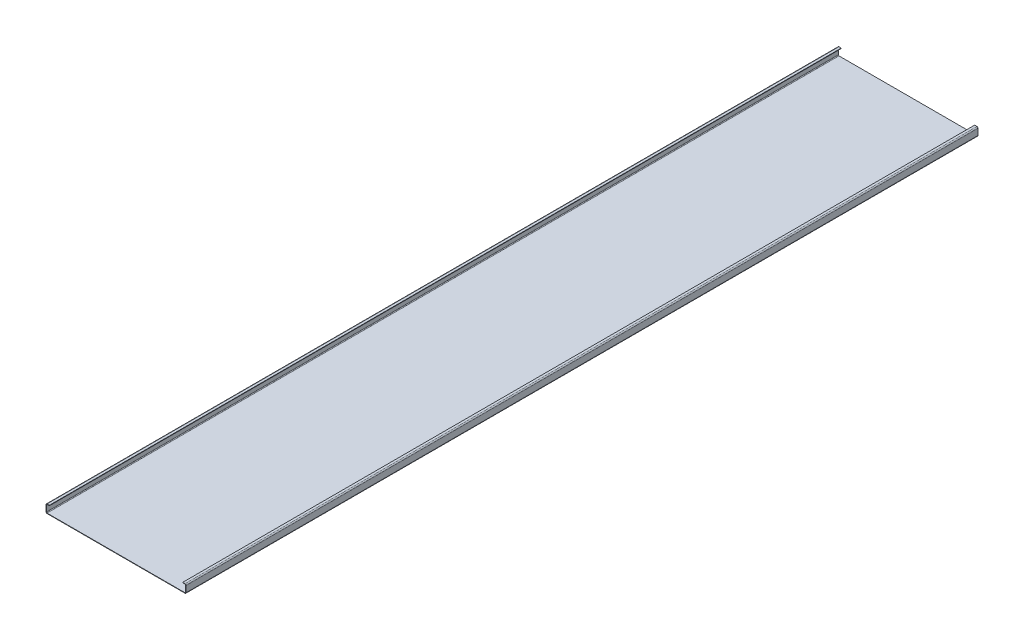
ISO-10303-21;
HEADER;
FILE_DESCRIPTION(('STEP AP214'),'2;1');
FILE_NAME('part.step','',(''),(''),'','','');
FILE_SCHEMA(('AUTOMOTIVE_DESIGN { 1 0 10303 214 1 1 1 1 }'));
ENDSEC;
DATA;
#1=APPLICATION_CONTEXT('core data for automotive mechanical design processes');
#2=APPLICATION_PROTOCOL_DEFINITION('international standard','automotive_design',2000,#1);
#3=PRODUCT_CONTEXT('',#1,'mechanical');
#4=PRODUCT('Part','Part','',(#3));
#5=PRODUCT_RELATED_PRODUCT_CATEGORY('part','',(#4));
#6=PRODUCT_DEFINITION_FORMATION('','',#4);
#7=PRODUCT_DEFINITION_CONTEXT('part definition',#1,'design');
#8=PRODUCT_DEFINITION('design','',#6,#7);
#9=PRODUCT_DEFINITION_SHAPE('','',#8);
#10=(LENGTH_UNIT() NAMED_UNIT(*) SI_UNIT(.MILLI.,.METRE.));
#11=(NAMED_UNIT(*) PLANE_ANGLE_UNIT() SI_UNIT($,.RADIAN.));
#12=(NAMED_UNIT(*) SI_UNIT($,.STERADIAN.) SOLID_ANGLE_UNIT());
#13=UNCERTAINTY_MEASURE_WITH_UNIT(LENGTH_MEASURE(1.E-05),#10,'distance_accuracy_value','');
#14=(GEOMETRIC_REPRESENTATION_CONTEXT(3) GLOBAL_UNCERTAINTY_ASSIGNED_CONTEXT((#13)) GLOBAL_UNIT_ASSIGNED_CONTEXT((#10,
#11,#12)) REPRESENTATION_CONTEXT('',''));
#15=CARTESIAN_POINT('',(0.,0.,0.));
#16=DIRECTION('',(0.,0.,1.));
#17=DIRECTION('',(1.,0.,0.));
#18=AXIS2_PLACEMENT_3D('',#15,#16,#17);
#19=CARTESIAN_POINT('',(3.25,25.,2380.));
#20=DIRECTION('',(0.,0.,1.));
#21=DIRECTION('',(1.,0.,0.));
#22=AXIS2_PLACEMENT_3D('',#19,#20,#21);
#23=PLANE('',#22);
#24=DIRECTION('',(0.,-1.,0.));
#25=VECTOR('',#24,1.);
#26=CARTESIAN_POINT('',(3.25,25.,2380.));
#27=LINE('',#26,#25);
#28=CARTESIAN_POINT('',(3.25,25.,2380.));
#29=VERTEX_POINT('',#28);
#30=CARTESIAN_POINT('',(3.25,23.75,2380.));
#31=VERTEX_POINT('',#30);
#32=EDGE_CURVE('E11',#29,#31,#27,.T.);
#33=ORIENTED_EDGE('',*,*,#32,.F.);
#34=CARTESIAN_POINT('',(3.25,21.75,2380.));
#35=DIRECTION('',(0.,0.,-1.));
#36=DIRECTION('',(-1.,0.,0.));
#37=AXIS2_PLACEMENT_3D('',#34,#35,#36);
#38=CIRCLE('',#37,3.25);
#39=CARTESIAN_POINT('',(0.,21.75,2380.));
#40=VERTEX_POINT('',#39);
#41=EDGE_CURVE('E361',#29,#40,#38,.F.);
#42=ORIENTED_EDGE('',*,*,#41,.T.);
#43=DIRECTION('',(-1.,0.,0.));
#44=VECTOR('',#43,1.);
#45=CARTESIAN_POINT('',(1.25,21.75,2380.));
#46=LINE('',#45,#44);
#47=CARTESIAN_POINT('',(1.25,21.75,2380.));
#48=VERTEX_POINT('',#47);
#49=EDGE_CURVE('E44',#48,#40,#46,.T.);
#50=ORIENTED_EDGE('',*,*,#49,.F.);
#51=CARTESIAN_POINT('',(3.25,21.75,2380.));
#52=DIRECTION('',(0.,0.,1.));
#53=DIRECTION('',(1.,0.,0.));
#54=AXIS2_PLACEMENT_3D('',#51,#52,#53);
#55=CIRCLE('',#54,2.);
#56=EDGE_CURVE('E436',#31,#48,#55,.T.);
#57=ORIENTED_EDGE('',*,*,#56,.F.);
#58=EDGE_LOOP('',(#33,#42,#50,#57));
#59=FACE_BOUND('',#58,.T.);
#60=ADVANCED_FACE('F36',(#59),#23,.T.);
#61=CARTESIAN_POINT('',(1.25,21.75,2380.));
#62=DIRECTION('',(0.,0.,1.));
#63=DIRECTION('',(1.,0.,0.));
#64=AXIS2_PLACEMENT_3D('',#61,#62,#63);
#65=PLANE('',#64);
#66=DIRECTION('',(-1.,0.,0.));
#67=VECTOR('',#66,1.);
#68=CARTESIAN_POINT('',(10.,25.,2380.));
#69=LINE('',#68,#67);
#70=CARTESIAN_POINT('',(10.,25.,2380.));
#71=VERTEX_POINT('',#70);
#72=EDGE_CURVE('E365',#71,#29,#69,.T.);
#73=ORIENTED_EDGE('',*,*,#72,.T.);
#74=ORIENTED_EDGE('',*,*,#32,.T.);
#75=DIRECTION('',(1.,0.,0.));
#76=VECTOR('',#75,1.);
#77=CARTESIAN_POINT('',(10.,23.75,2380.));
#78=LINE('',#77,#76);
#79=CARTESIAN_POINT('',(10.,23.75,2380.));
#80=VERTEX_POINT('',#79);
#81=EDGE_CURVE('E438',#80,#31,#78,.F.);
#82=ORIENTED_EDGE('',*,*,#81,.F.);
#83=DIRECTION('',(0.,-1.,0.));
#84=VECTOR('',#83,1.);
#85=CARTESIAN_POINT('',(10.,25.,2380.));
#86=LINE('',#85,#84);
#87=EDGE_CURVE('E441',#71,#80,#86,.T.);
#88=ORIENTED_EDGE('',*,*,#87,.F.);
#89=EDGE_LOOP('',(#73,#74,#82,#88));
#90=FACE_BOUND('',#89,.T.);
#91=ADVANCED_FACE('F447',(#90),#65,.T.);
#92=CARTESIAN_POINT('',(0.,21.75,0.));
#93=DIRECTION('',(0.,0.,-1.));
#94=DIRECTION('',(-1.,0.,0.));
#95=AXIS2_PLACEMENT_3D('',#92,#93,#94);
#96=PLANE('',#95);
#97=DIRECTION('',(1.,0.,0.));
#98=VECTOR('',#97,1.);
#99=CARTESIAN_POINT('',(0.,21.75,0.));
#100=LINE('',#99,#98);
#101=CARTESIAN_POINT('',(0.,21.75,0.));
#102=VERTEX_POINT('',#101);
#103=CARTESIAN_POINT('',(1.25,21.75,0.));
#104=VERTEX_POINT('',#103);
#105=EDGE_CURVE('E345',#102,#104,#100,.T.);
#106=ORIENTED_EDGE('',*,*,#105,.F.);
#107=CARTESIAN_POINT('',(3.25,21.75,0.));
#108=DIRECTION('',(0.,0.,-1.));
#109=DIRECTION('',(-1.,0.,0.));
#110=AXIS2_PLACEMENT_3D('',#107,#108,#109);
#111=CIRCLE('',#110,3.25);
#112=CARTESIAN_POINT('',(3.25,25.,0.));
#113=VERTEX_POINT('',#112);
#114=EDGE_CURVE('E261',#113,#102,#111,.F.);
#115=ORIENTED_EDGE('',*,*,#114,.F.);
#116=DIRECTION('',(0.,1.,0.));
#117=VECTOR('',#116,1.);
#118=CARTESIAN_POINT('',(3.25,23.75,0.));
#119=LINE('',#118,#117);
#120=CARTESIAN_POINT('',(3.25,23.75,0.));
#121=VERTEX_POINT('',#120);
#122=EDGE_CURVE('E343',#121,#113,#119,.T.);
#123=ORIENTED_EDGE('',*,*,#122,.F.);
#124=CARTESIAN_POINT('',(3.25,21.75,0.));
#125=DIRECTION('',(0.,0.,1.));
#126=DIRECTION('',(1.,0.,0.));
#127=AXIS2_PLACEMENT_3D('',#124,#125,#126);
#128=CIRCLE('',#127,2.);
#129=EDGE_CURVE('E249',#121,#104,#128,.T.);
#130=ORIENTED_EDGE('',*,*,#129,.T.);
#131=EDGE_LOOP('',(#106,#115,#123,#130));
#132=FACE_BOUND('',#131,.T.);
#133=ADVANCED_FACE('F454',(#132),#96,.T.);
#134=CARTESIAN_POINT('',(3.25,23.75,0.));
#135=DIRECTION('',(0.,0.,-1.));
#136=DIRECTION('',(-1.,0.,0.));
#137=AXIS2_PLACEMENT_3D('',#134,#135,#136);
#138=PLANE('',#137);
#139=DIRECTION('',(0.,-1.,0.));
#140=VECTOR('',#139,1.);
#141=CARTESIAN_POINT('',(0.,25.,0.));
#142=LINE('',#141,#140);
#143=CARTESIAN_POINT('',(0.,3.25,0.));
#144=VERTEX_POINT('',#143);
#145=EDGE_CURVE('E264',#102,#144,#142,.T.);
#146=ORIENTED_EDGE('',*,*,#145,.F.);
#147=ORIENTED_EDGE('',*,*,#105,.T.);
#148=DIRECTION('',(0.,1.,0.));
#149=VECTOR('',#148,1.);
#150=CARTESIAN_POINT('',(1.25,25.,0.));
#151=LINE('',#150,#149);
#152=CARTESIAN_POINT('',(1.25,3.25,0.));
#153=VERTEX_POINT('',#152);
#154=EDGE_CURVE('E246',#104,#153,#151,.F.);
#155=ORIENTED_EDGE('',*,*,#154,.T.);
#156=DIRECTION('',(-1.,0.,0.));
#157=VECTOR('',#156,1.);
#158=CARTESIAN_POINT('',(1.25,3.25,0.));
#159=LINE('',#158,#157);
#160=EDGE_CURVE('E335',#153,#144,#159,.T.);
#161=ORIENTED_EDGE('',*,*,#160,.T.);
#162=EDGE_LOOP('',(#146,#147,#155,#161));
#163=FACE_BOUND('',#162,.T.);
#164=ADVANCED_FACE('F457',(#163),#138,.T.);
#165=CARTESIAN_POINT('',(0.,3.25,2380.));
#166=DIRECTION('',(0.,0.,1.));
#167=DIRECTION('',(1.,0.,0.));
#168=AXIS2_PLACEMENT_3D('',#165,#166,#167);
#169=PLANE('',#168);
#170=DIRECTION('',(1.,0.,0.));
#171=VECTOR('',#170,1.);
#172=CARTESIAN_POINT('',(0.,3.25,2380.));
#173=LINE('',#172,#171);
#174=CARTESIAN_POINT('',(0.,3.25,2380.));
#175=VERTEX_POINT('',#174);
#176=CARTESIAN_POINT('',(1.25,3.25,2380.));
#177=VERTEX_POINT('',#176);
#178=EDGE_CURVE('E341',#175,#177,#173,.T.);
#179=ORIENTED_EDGE('',*,*,#178,.F.);
#180=CARTESIAN_POINT('',(3.25,3.25,2380.));
#181=DIRECTION('',(0.,0.,-1.));
#182=DIRECTION('',(-1.,0.,0.));
#183=AXIS2_PLACEMENT_3D('',#180,#181,#182);
#184=CIRCLE('',#183,3.25);
#185=CARTESIAN_POINT('',(3.25,0.,2380.));
#186=VERTEX_POINT('',#185);
#187=EDGE_CURVE('E373',#175,#186,#184,.F.);
#188=ORIENTED_EDGE('',*,*,#187,.T.);
#189=DIRECTION('',(0.,-1.,0.));
#190=VECTOR('',#189,1.);
#191=CARTESIAN_POINT('',(3.25,1.25,2380.));
#192=LINE('',#191,#190);
#193=CARTESIAN_POINT('',(3.25,1.25,2380.));
#194=VERTEX_POINT('',#193);
#195=EDGE_CURVE('E339',#194,#186,#192,.T.);
#196=ORIENTED_EDGE('',*,*,#195,.F.);
#197=CARTESIAN_POINT('',(3.25,3.25,2380.));
#198=DIRECTION('',(0.,0.,1.));
#199=DIRECTION('',(1.,0.,0.));
#200=AXIS2_PLACEMENT_3D('',#197,#198,#199);
#201=CIRCLE('',#200,2.);
#202=EDGE_CURVE('E432',#177,#194,#201,.T.);
#203=ORIENTED_EDGE('',*,*,#202,.F.);
#204=EDGE_LOOP('',(#179,#188,#196,#203));
#205=FACE_BOUND('',#204,.T.);
#206=ADVANCED_FACE('F477',(#205),#169,.T.);
#207=CARTESIAN_POINT('',(3.25,1.25,2380.));
#208=DIRECTION('',(0.,0.,1.));
#209=DIRECTION('',(1.,0.,0.));
#210=AXIS2_PLACEMENT_3D('',#207,#208,#209);
#211=PLANE('',#210);
#212=DIRECTION('',(0.,-1.,0.));
#213=VECTOR('',#212,1.);
#214=CARTESIAN_POINT('',(0.,25.,2380.));
#215=LINE('',#214,#213);
#216=EDGE_CURVE('E352',#40,#175,#215,.T.);
#217=ORIENTED_EDGE('',*,*,#216,.T.);
#218=ORIENTED_EDGE('',*,*,#178,.T.);
#219=DIRECTION('',(0.,1.,0.));
#220=VECTOR('',#219,1.);
#221=CARTESIAN_POINT('',(1.25,25.,2380.));
#222=LINE('',#221,#220);
#223=EDGE_CURVE('E355',#48,#177,#222,.F.);
#224=ORIENTED_EDGE('',*,*,#223,.F.);
#225=ORIENTED_EDGE('',*,*,#49,.T.);
#226=EDGE_LOOP('',(#217,#218,#224,#225));
#227=FACE_BOUND('',#226,.T.);
#228=ADVANCED_FACE('F350',(#227),#211,.T.);
#229=CARTESIAN_POINT('',(3.25,0.,0.));
#230=DIRECTION('',(0.,0.,-1.));
#231=DIRECTION('',(-1.,0.,0.));
#232=AXIS2_PLACEMENT_3D('',#229,#230,#231);
#233=PLANE('',#232);
#234=DIRECTION('',(0.,1.,0.));
#235=VECTOR('',#234,1.);
#236=CARTESIAN_POINT('',(3.25,0.,0.));
#237=LINE('',#236,#235);
#238=CARTESIAN_POINT('',(3.25,0.,0.));
#239=VERTEX_POINT('',#238);
#240=CARTESIAN_POINT('',(3.25,1.25,0.));
#241=VERTEX_POINT('',#240);
#242=EDGE_CURVE('E337',#239,#241,#237,.T.);
#243=ORIENTED_EDGE('',*,*,#242,.F.);
#244=CARTESIAN_POINT('',(3.25,3.25,0.));
#245=DIRECTION('',(0.,0.,-1.));
#246=DIRECTION('',(-1.,0.,0.));
#247=AXIS2_PLACEMENT_3D('',#244,#245,#246);
#248=CIRCLE('',#247,3.25);
#249=EDGE_CURVE('E267',#144,#239,#248,.F.);
#250=ORIENTED_EDGE('',*,*,#249,.F.);
#251=ORIENTED_EDGE('',*,*,#160,.F.);
#252=CARTESIAN_POINT('',(3.25,3.25,0.));
#253=DIRECTION('',(0.,0.,1.));
#254=DIRECTION('',(1.,0.,0.));
#255=AXIS2_PLACEMENT_3D('',#252,#253,#254);
#256=CIRCLE('',#255,2.);
#257=EDGE_CURVE('E243',#153,#241,#256,.T.);
#258=ORIENTED_EDGE('',*,*,#257,.T.);
#259=EDGE_LOOP('',(#243,#250,#251,#258));
#260=FACE_BOUND('',#259,.T.);
#261=ADVANCED_FACE('F471',(#260),#233,.T.);
#262=CARTESIAN_POINT('',(1.25,3.25,0.));
#263=DIRECTION('',(0.,0.,-1.));
#264=DIRECTION('',(-1.,0.,0.));
#265=AXIS2_PLACEMENT_3D('',#262,#263,#264);
#266=PLANE('',#265);
#267=DIRECTION('',(1.,0.,0.));
#268=VECTOR('',#267,1.);
#269=CARTESIAN_POINT('',(0.,0.,0.));
#270=LINE('',#269,#268);
#271=CARTESIAN_POINT('',(417.75,0.,0.));
#272=VERTEX_POINT('',#271);
#273=EDGE_CURVE('E270',#239,#272,#270,.T.);
#274=ORIENTED_EDGE('',*,*,#273,.F.);
#275=ORIENTED_EDGE('',*,*,#242,.T.);
#276=DIRECTION('',(1.,0.,0.));
#277=VECTOR('',#276,1.);
#278=CARTESIAN_POINT('',(0.,1.25,0.));
#279=LINE('',#278,#277);
#280=CARTESIAN_POINT('',(417.75,1.25,0.));
#281=VERTEX_POINT('',#280);
#282=EDGE_CURVE('E240',#241,#281,#279,.T.);
#283=ORIENTED_EDGE('',*,*,#282,.T.);
#284=DIRECTION('',(0.,-1.,0.));
#285=VECTOR('',#284,1.);
#286=CARTESIAN_POINT('',(417.75,1.25,0.));
#287=LINE('',#286,#285);
#288=EDGE_CURVE('E331',#281,#272,#287,.T.);
#289=ORIENTED_EDGE('',*,*,#288,.T.);
#290=EDGE_LOOP('',(#274,#275,#283,#289));
#291=FACE_BOUND('',#290,.T.);
#292=ADVANCED_FACE('F481',(#291),#266,.T.);
#293=CARTESIAN_POINT('',(417.75,0.,2380.));
#294=DIRECTION('',(0.,0.,1.));
#295=DIRECTION('',(1.,0.,0.));
#296=AXIS2_PLACEMENT_3D('',#293,#294,#295);
#297=PLANE('',#296);
#298=DIRECTION('',(0.,1.,0.));
#299=VECTOR('',#298,1.);
#300=CARTESIAN_POINT('',(417.75,0.,2380.));
#301=LINE('',#300,#299);
#302=CARTESIAN_POINT('',(417.75,0.,2380.));
#303=VERTEX_POINT('',#302);
#304=CARTESIAN_POINT('',(417.75,1.25,2380.));
#305=VERTEX_POINT('',#304);
#306=EDGE_CURVE('E193',#303,#305,#301,.T.);
#307=ORIENTED_EDGE('',*,*,#306,.F.);
#308=CARTESIAN_POINT('',(417.75,3.25,2380.));
#309=DIRECTION('',(0.,0.,-1.));
#310=DIRECTION('',(-1.,0.,0.));
#311=AXIS2_PLACEMENT_3D('',#308,#309,#310);
#312=CIRCLE('',#311,3.25);
#313=CARTESIAN_POINT('',(421.,3.25,2380.));
#314=VERTEX_POINT('',#313);
#315=EDGE_CURVE('E197',#303,#314,#312,.F.);
#316=ORIENTED_EDGE('',*,*,#315,.T.);
#317=DIRECTION('',(1.,0.,0.));
#318=VECTOR('',#317,1.);
#319=CARTESIAN_POINT('',(419.75,3.25,2380.));
#320=LINE('',#319,#318);
#321=CARTESIAN_POINT('',(419.75,3.25,2380.));
#322=VERTEX_POINT('',#321);
#323=EDGE_CURVE('E181',#322,#314,#320,.T.);
#324=ORIENTED_EDGE('',*,*,#323,.F.);
#325=CARTESIAN_POINT('',(417.75,3.25,2380.));
#326=DIRECTION('',(0.,0.,1.));
#327=DIRECTION('',(1.,0.,0.));
#328=AXIS2_PLACEMENT_3D('',#325,#326,#327);
#329=CIRCLE('',#328,2.);
#330=EDGE_CURVE('E394',#305,#322,#329,.T.);
#331=ORIENTED_EDGE('',*,*,#330,.F.);
#332=EDGE_LOOP('',(#307,#316,#324,#331));
#333=FACE_BOUND('',#332,.T.);
#334=ADVANCED_FACE('F199',(#333),#297,.T.);
#335=CARTESIAN_POINT('',(419.75,3.25,2380.));
#336=DIRECTION('',(0.,0.,1.));
#337=DIRECTION('',(1.,0.,0.));
#338=AXIS2_PLACEMENT_3D('',#335,#336,#337);
#339=PLANE('',#338);
#340=DIRECTION('',(1.,0.,0.));
#341=VECTOR('',#340,1.);
#342=CARTESIAN_POINT('',(0.,0.,2380.));
#343=LINE('',#342,#341);
#344=EDGE_CURVE('E203',#186,#303,#343,.T.);
#345=ORIENTED_EDGE('',*,*,#344,.T.);
#346=ORIENTED_EDGE('',*,*,#306,.T.);
#347=DIRECTION('',(1.,0.,0.));
#348=VECTOR('',#347,1.);
#349=CARTESIAN_POINT('',(0.,1.25,2380.));
#350=LINE('',#349,#348);
#351=EDGE_CURVE('E429',#194,#305,#350,.T.);
#352=ORIENTED_EDGE('',*,*,#351,.F.);
#353=ORIENTED_EDGE('',*,*,#195,.T.);
#354=EDGE_LOOP('',(#345,#346,#352,#353));
#355=FACE_BOUND('',#354,.T.);
#356=ADVANCED_FACE('F381',(#355),#339,.T.);
#357=CARTESIAN_POINT('',(421.,3.25,0.));
#358=DIRECTION('',(0.,0.,-1.));
#359=DIRECTION('',(-1.,0.,0.));
#360=AXIS2_PLACEMENT_3D('',#357,#358,#359);
#361=PLANE('',#360);
#362=DIRECTION('',(-1.,0.,0.));
#363=VECTOR('',#362,1.);
#364=CARTESIAN_POINT('',(421.,3.25,0.));
#365=LINE('',#364,#363);
#366=CARTESIAN_POINT('',(421.,3.25,0.));
#367=VERTEX_POINT('',#366);
#368=CARTESIAN_POINT('',(419.75,3.25,0.));
#369=VERTEX_POINT('',#368);
#370=EDGE_CURVE('E194',#367,#369,#365,.T.);
#371=ORIENTED_EDGE('',*,*,#370,.F.);
#372=CARTESIAN_POINT('',(417.75,3.25,0.));
#373=DIRECTION('',(0.,0.,-1.));
#374=DIRECTION('',(-1.,0.,0.));
#375=AXIS2_PLACEMENT_3D('',#372,#373,#374);
#376=CIRCLE('',#375,3.25);
#377=EDGE_CURVE('E210',#272,#367,#376,.F.);
#378=ORIENTED_EDGE('',*,*,#377,.F.);
#379=ORIENTED_EDGE('',*,*,#288,.F.);
#380=CARTESIAN_POINT('',(417.75,3.25,0.));
#381=DIRECTION('',(0.,0.,1.));
#382=DIRECTION('',(1.,0.,0.));
#383=AXIS2_PLACEMENT_3D('',#380,#381,#382);
#384=CIRCLE('',#383,2.);
#385=EDGE_CURVE('E237',#281,#369,#384,.T.);
#386=ORIENTED_EDGE('',*,*,#385,.T.);
#387=EDGE_LOOP('',(#371,#378,#379,#386));
#388=FACE_BOUND('',#387,.T.);
#389=ADVANCED_FACE('F388',(#388),#361,.T.);
#390=CARTESIAN_POINT('',(417.75,1.25,0.));
#391=DIRECTION('',(0.,0.,-1.));
#392=DIRECTION('',(-1.,0.,0.));
#393=AXIS2_PLACEMENT_3D('',#390,#391,#392);
#394=PLANE('',#393);
#395=DIRECTION('',(0.,1.,0.));
#396=VECTOR('',#395,1.);
#397=CARTESIAN_POINT('',(421.,0.,0.));
#398=LINE('',#397,#396);
#399=CARTESIAN_POINT('',(421.,21.75,0.));
#400=VERTEX_POINT('',#399);
#401=EDGE_CURVE('E274',#367,#400,#398,.T.);
#402=ORIENTED_EDGE('',*,*,#401,.F.);
#403=ORIENTED_EDGE('',*,*,#370,.T.);
#404=DIRECTION('',(0.,1.,0.));
#405=VECTOR('',#404,1.);
#406=CARTESIAN_POINT('',(419.75,0.,0.));
#407=LINE('',#406,#405);
#408=CARTESIAN_POINT('',(419.75,21.75,0.));
#409=VERTEX_POINT('',#408);
#410=EDGE_CURVE('E235',#369,#409,#407,.T.);
#411=ORIENTED_EDGE('',*,*,#410,.T.);
#412=DIRECTION('',(1.,0.,0.));
#413=VECTOR('',#412,1.);
#414=CARTESIAN_POINT('',(419.75,21.75,0.));
#415=LINE('',#414,#413);
#416=EDGE_CURVE('E117',#409,#400,#415,.T.);
#417=ORIENTED_EDGE('',*,*,#416,.T.);
#418=EDGE_LOOP('',(#402,#403,#411,#417));
#419=FACE_BOUND('',#418,.T.);
#420=ADVANCED_FACE('F390',(#419),#394,.T.);
#421=CARTESIAN_POINT('',(421.,21.75,2380.));
#422=DIRECTION('',(0.,0.,1.));
#423=DIRECTION('',(1.,0.,0.));
#424=AXIS2_PLACEMENT_3D('',#421,#422,#423);
#425=PLANE('',#424);
#426=DIRECTION('',(-1.,0.,0.));
#427=VECTOR('',#426,1.);
#428=CARTESIAN_POINT('',(421.,21.75,2380.));
#429=LINE('',#428,#427);
#430=CARTESIAN_POINT('',(421.,21.75,2380.));
#431=VERTEX_POINT('',#430);
#432=CARTESIAN_POINT('',(419.75,21.75,2380.));
#433=VERTEX_POINT('',#432);
#434=EDGE_CURVE('E329',#431,#433,#429,.T.);
#435=ORIENTED_EDGE('',*,*,#434,.F.);
#436=CARTESIAN_POINT('',(417.75,21.75,2380.));
#437=DIRECTION('',(0.,0.,-1.));
#438=DIRECTION('',(-1.,0.,0.));
#439=AXIS2_PLACEMENT_3D('',#436,#437,#438);
#440=CIRCLE('',#439,3.25);
#441=CARTESIAN_POINT('',(417.75,25.,2380.));
#442=VERTEX_POINT('',#441);
#443=EDGE_CURVE('E218',#431,#442,#440,.F.);
#444=ORIENTED_EDGE('',*,*,#443,.T.);
#445=DIRECTION('',(0.,1.,0.));
#446=VECTOR('',#445,1.);
#447=CARTESIAN_POINT('',(417.75,23.75,2380.));
#448=LINE('',#447,#446);
#449=CARTESIAN_POINT('',(417.75,23.75,2380.));
#450=VERTEX_POINT('',#449);
#451=EDGE_CURVE('E52',#450,#442,#448,.T.);
#452=ORIENTED_EDGE('',*,*,#451,.F.);
#453=CARTESIAN_POINT('',(417.75,21.75,2380.));
#454=DIRECTION('',(0.,0.,1.));
#455=DIRECTION('',(1.,0.,0.));
#456=AXIS2_PLACEMENT_3D('',#453,#454,#455);
#457=CIRCLE('',#456,2.);
#458=EDGE_CURVE('E422',#433,#450,#457,.T.);
#459=ORIENTED_EDGE('',*,*,#458,.F.);
#460=EDGE_LOOP('',(#435,#444,#452,#459));
#461=FACE_BOUND('',#460,.T.);
#462=ADVANCED_FACE('F552',(#461),#425,.T.);
#463=CARTESIAN_POINT('',(417.75,23.75,2380.));
#464=DIRECTION('',(0.,0.,1.));
#465=DIRECTION('',(1.,0.,0.));
#466=AXIS2_PLACEMENT_3D('',#463,#464,#465);
#467=PLANE('',#466);
#468=DIRECTION('',(0.,1.,0.));
#469=VECTOR('',#468,1.);
#470=CARTESIAN_POINT('',(421.,0.,2380.));
#471=LINE('',#470,#469);
#472=EDGE_CURVE('E185',#314,#431,#471,.T.);
#473=ORIENTED_EDGE('',*,*,#472,.T.);
#474=ORIENTED_EDGE('',*,*,#434,.T.);
#475=DIRECTION('',(0.,1.,0.));
#476=VECTOR('',#475,1.);
#477=CARTESIAN_POINT('',(419.75,0.,2380.));
#478=LINE('',#477,#476);
#479=EDGE_CURVE('E188',#322,#433,#478,.T.);
#480=ORIENTED_EDGE('',*,*,#479,.F.);
#481=ORIENTED_EDGE('',*,*,#323,.T.);
#482=EDGE_LOOP('',(#473,#474,#480,#481));
#483=FACE_BOUND('',#482,.T.);
#484=ADVANCED_FACE('F183',(#483),#467,.T.);
#485=CARTESIAN_POINT('',(417.75,25.,0.));
#486=DIRECTION('',(0.,0.,-1.));
#487=DIRECTION('',(-1.,0.,0.));
#488=AXIS2_PLACEMENT_3D('',#485,#486,#487);
#489=PLANE('',#488);
#490=DIRECTION('',(0.,-1.,0.));
#491=VECTOR('',#490,1.);
#492=CARTESIAN_POINT('',(417.75,25.,0.));
#493=LINE('',#492,#491);
#494=CARTESIAN_POINT('',(417.75,25.,0.));
#495=VERTEX_POINT('',#494);
#496=CARTESIAN_POINT('',(417.75,23.75,0.));
#497=VERTEX_POINT('',#496);
#498=EDGE_CURVE('E124',#495,#497,#493,.T.);
#499=ORIENTED_EDGE('',*,*,#498,.F.);
#500=CARTESIAN_POINT('',(417.75,21.75,0.));
#501=DIRECTION('',(0.,0.,-1.));
#502=DIRECTION('',(-1.,0.,0.));
#503=AXIS2_PLACEMENT_3D('',#500,#501,#502);
#504=CIRCLE('',#503,3.25);
#505=EDGE_CURVE('E276',#400,#495,#504,.F.);
#506=ORIENTED_EDGE('',*,*,#505,.F.);
#507=ORIENTED_EDGE('',*,*,#416,.F.);
#508=CARTESIAN_POINT('',(417.75,21.75,0.));
#509=DIRECTION('',(0.,0.,1.));
#510=DIRECTION('',(1.,0.,0.));
#511=AXIS2_PLACEMENT_3D('',#508,#509,#510);
#512=CIRCLE('',#511,2.);
#513=EDGE_CURVE('E233',#409,#497,#512,.T.);
#514=ORIENTED_EDGE('',*,*,#513,.T.);
#515=EDGE_LOOP('',(#499,#506,#507,#514));
#516=FACE_BOUND('',#515,.T.);
#517=ADVANCED_FACE('F405',(#516),#489,.T.);
#518=CARTESIAN_POINT('',(419.75,21.75,0.));
#519=DIRECTION('',(0.,0.,-1.));
#520=DIRECTION('',(-1.,0.,0.));
#521=AXIS2_PLACEMENT_3D('',#518,#519,#520);
#522=PLANE('',#521);
#523=DIRECTION('',(-1.,0.,0.));
#524=VECTOR('',#523,1.);
#525=CARTESIAN_POINT('',(421.,25.,0.));
#526=LINE('',#525,#524);
#527=CARTESIAN_POINT('',(411.,25.,0.));
#528=VERTEX_POINT('',#527);
#529=EDGE_CURVE('E224',#495,#528,#526,.T.);
#530=ORIENTED_EDGE('',*,*,#529,.F.);
#531=ORIENTED_EDGE('',*,*,#498,.T.);
#532=DIRECTION('',(1.,0.,0.));
#533=VECTOR('',#532,1.);
#534=CARTESIAN_POINT('',(421.,23.75,0.));
#535=LINE('',#534,#533);
#536=CARTESIAN_POINT('',(411.,23.75,0.));
#537=VERTEX_POINT('',#536);
#538=EDGE_CURVE('E230',#497,#537,#535,.F.);
#539=ORIENTED_EDGE('',*,*,#538,.T.);
#540=DIRECTION('',(0.,1.,0.));
#541=VECTOR('',#540,1.);
#542=CARTESIAN_POINT('',(411.,23.75,0.));
#543=LINE('',#542,#541);
#544=EDGE_CURVE('E227',#537,#528,#543,.T.);
#545=ORIENTED_EDGE('',*,*,#544,.T.);
#546=EDGE_LOOP('',(#530,#531,#539,#545));
#547=FACE_BOUND('',#546,.T.);
#548=ADVANCED_FACE('F413',(#547),#522,.T.);
#549=CARTESIAN_POINT('',(421.,25.,2380.));
#550=DIRECTION('',(0.,-1.,0.));
#551=DIRECTION('',(0.,0.,-1.));
#552=AXIS2_PLACEMENT_3D('',#549,#550,#551);
#553=PLANE('',#552);
#554=ORIENTED_EDGE('',*,*,#529,.T.);
#555=DIRECTION('',(0.,0.,-1.));
#556=VECTOR('',#555,1.);
#557=CARTESIAN_POINT('',(411.,25.,2380.));
#558=LINE('',#557,#556);
#559=CARTESIAN_POINT('',(411.,25.,2380.));
#560=VERTEX_POINT('',#559);
#561=EDGE_CURVE('E324',#560,#528,#558,.T.);
#562=ORIENTED_EDGE('',*,*,#561,.F.);
#563=DIRECTION('',(-1.,0.,0.));
#564=VECTOR('',#563,1.);
#565=CARTESIAN_POINT('',(421.,25.,2380.));
#566=LINE('',#565,#564);
#567=EDGE_CURVE('E130',#442,#560,#566,.T.);
#568=ORIENTED_EDGE('',*,*,#567,.F.);
#569=DIRECTION('',(0.,0.,-1.));
#570=VECTOR('',#569,1.);
#571=CARTESIAN_POINT('',(417.75,25.,2380.));
#572=LINE('',#571,#570);
#573=EDGE_CURVE('E220',#442,#495,#572,.T.);
#574=ORIENTED_EDGE('',*,*,#573,.T.);
#575=EDGE_LOOP('',(#554,#562,#568,#574));
#576=FACE_BOUND('',#575,.T.);
#577=ADVANCED_FACE('F411',(#576),#553,.F.);
#578=CARTESIAN_POINT('',(411.,23.75,2380.));
#579=DIRECTION('',(-1.,0.,0.));
#580=DIRECTION('',(0.,0.,1.));
#581=AXIS2_PLACEMENT_3D('',#578,#579,#580);
#582=PLANE('',#581);
#583=ORIENTED_EDGE('',*,*,#544,.F.);
#584=DIRECTION('',(0.,0.,-1.));
#585=VECTOR('',#584,1.);
#586=CARTESIAN_POINT('',(411.,23.75,2380.));
#587=LINE('',#586,#585);
#588=CARTESIAN_POINT('',(411.,23.75,2380.));
#589=VERTEX_POINT('',#588);
#590=EDGE_CURVE('E322',#589,#537,#587,.T.);
#591=ORIENTED_EDGE('',*,*,#590,.F.);
#592=DIRECTION('',(0.,1.,0.));
#593=VECTOR('',#592,1.);
#594=CARTESIAN_POINT('',(411.,23.75,2380.));
#595=LINE('',#594,#593);
#596=EDGE_CURVE('E418',#589,#560,#595,.T.);
#597=ORIENTED_EDGE('',*,*,#596,.T.);
#598=ORIENTED_EDGE('',*,*,#561,.T.);
#599=EDGE_LOOP('',(#583,#591,#597,#598));
#600=FACE_BOUND('',#599,.T.);
#601=ADVANCED_FACE('F416',(#600),#582,.T.);
#602=CARTESIAN_POINT('',(421.,23.75,2380.));
#603=DIRECTION('',(0.,-1.,0.));
#604=DIRECTION('',(0.,0.,-1.));
#605=AXIS2_PLACEMENT_3D('',#602,#603,#604);
#606=PLANE('',#605);
#607=ORIENTED_EDGE('',*,*,#538,.F.);
#608=DIRECTION('',(0.,0.,-1.));
#609=VECTOR('',#608,1.);
#610=CARTESIAN_POINT('',(417.75,23.75,2380.));
#611=LINE('',#610,#609);
#612=EDGE_CURVE('E319',#450,#497,#611,.T.);
#613=ORIENTED_EDGE('',*,*,#612,.F.);
#614=DIRECTION('',(1.,0.,0.));
#615=VECTOR('',#614,1.);
#616=CARTESIAN_POINT('',(421.,23.75,2380.));
#617=LINE('',#616,#615);
#618=EDGE_CURVE('E420',#450,#589,#617,.F.);
#619=ORIENTED_EDGE('',*,*,#618,.T.);
#620=ORIENTED_EDGE('',*,*,#590,.T.);
#621=EDGE_LOOP('',(#607,#613,#619,#620));
#622=FACE_BOUND('',#621,.T.);
#623=ADVANCED_FACE('F608',(#622),#606,.T.);
#624=CARTESIAN_POINT('',(417.75,21.75,2380.));
#625=DIRECTION('',(0.,0.,-1.));
#626=DIRECTION('',(-1.,0.,0.));
#627=AXIS2_PLACEMENT_3D('',#624,#625,#626);
#628=CYLINDRICAL_SURFACE('',#627,2.);
#629=ORIENTED_EDGE('',*,*,#513,.F.);
#630=DIRECTION('',(0.,0.,-1.));
#631=VECTOR('',#630,1.);
#632=CARTESIAN_POINT('',(419.75,21.75,2380.));
#633=LINE('',#632,#631);
#634=EDGE_CURVE('E316',#433,#409,#633,.T.);
#635=ORIENTED_EDGE('',*,*,#634,.F.);
#636=ORIENTED_EDGE('',*,*,#458,.T.);
#637=ORIENTED_EDGE('',*,*,#612,.T.);
#638=EDGE_LOOP('',(#629,#635,#636,#637));
#639=FACE_BOUND('',#638,.T.);
#640=ADVANCED_FACE('F402',(#639),#628,.F.);
#641=CARTESIAN_POINT('',(419.75,0.,2380.));
#642=DIRECTION('',(-1.,0.,0.));
#643=DIRECTION('',(0.,0.,1.));
#644=AXIS2_PLACEMENT_3D('',#641,#642,#643);
#645=PLANE('',#644);
#646=ORIENTED_EDGE('',*,*,#410,.F.);
#647=DIRECTION('',(0.,0.,-1.));
#648=VECTOR('',#647,1.);
#649=CARTESIAN_POINT('',(419.75,3.25,2380.));
#650=LINE('',#649,#648);
#651=EDGE_CURVE('E313',#322,#369,#650,.T.);
#652=ORIENTED_EDGE('',*,*,#651,.F.);
#653=ORIENTED_EDGE('',*,*,#479,.T.);
#654=ORIENTED_EDGE('',*,*,#634,.T.);
#655=EDGE_LOOP('',(#646,#652,#653,#654));
#656=FACE_BOUND('',#655,.T.);
#657=ADVANCED_FACE('F396',(#656),#645,.T.);
#658=CARTESIAN_POINT('',(417.75,3.25,2380.));
#659=DIRECTION('',(0.,0.,-1.));
#660=DIRECTION('',(-1.,0.,0.));
#661=AXIS2_PLACEMENT_3D('',#658,#659,#660);
#662=CYLINDRICAL_SURFACE('',#661,2.);
#663=ORIENTED_EDGE('',*,*,#385,.F.);
#664=DIRECTION('',(0.,0.,-1.));
#665=VECTOR('',#664,1.);
#666=CARTESIAN_POINT('',(417.75,1.25,2380.));
#667=LINE('',#666,#665);
#668=EDGE_CURVE('E310',#305,#281,#667,.T.);
#669=ORIENTED_EDGE('',*,*,#668,.F.);
#670=ORIENTED_EDGE('',*,*,#330,.T.);
#671=ORIENTED_EDGE('',*,*,#651,.T.);
#672=EDGE_LOOP('',(#663,#669,#670,#671));
#673=FACE_BOUND('',#672,.T.);
#674=ADVANCED_FACE('F393',(#673),#662,.F.);
#675=CARTESIAN_POINT('',(0.,1.25,2380.));
#676=DIRECTION('',(0.,1.,0.));
#677=DIRECTION('',(0.,0.,1.));
#678=AXIS2_PLACEMENT_3D('',#675,#676,#677);
#679=PLANE('',#678);
#680=ORIENTED_EDGE('',*,*,#282,.F.);
#681=DIRECTION('',(0.,0.,-1.));
#682=VECTOR('',#681,1.);
#683=CARTESIAN_POINT('',(3.25,1.25,2380.));
#684=LINE('',#683,#682);
#685=EDGE_CURVE('E307',#194,#241,#684,.T.);
#686=ORIENTED_EDGE('',*,*,#685,.F.);
#687=ORIENTED_EDGE('',*,*,#351,.T.);
#688=ORIENTED_EDGE('',*,*,#668,.T.);
#689=EDGE_LOOP('',(#680,#686,#687,#688));
#690=FACE_BOUND('',#689,.T.);
#691=ADVANCED_FACE('F479',(#690),#679,.T.);
#692=CARTESIAN_POINT('',(3.25,3.25,2380.));
#693=DIRECTION('',(0.,0.,-1.));
#694=DIRECTION('',(-1.,0.,0.));
#695=AXIS2_PLACEMENT_3D('',#692,#693,#694);
#696=CYLINDRICAL_SURFACE('',#695,2.);
#697=ORIENTED_EDGE('',*,*,#257,.F.);
#698=DIRECTION('',(0.,0.,-1.));
#699=VECTOR('',#698,1.);
#700=CARTESIAN_POINT('',(1.25,3.25,2380.));
#701=LINE('',#700,#699);
#702=EDGE_CURVE('E304',#177,#153,#701,.T.);
#703=ORIENTED_EDGE('',*,*,#702,.F.);
#704=ORIENTED_EDGE('',*,*,#202,.T.);
#705=ORIENTED_EDGE('',*,*,#685,.T.);
#706=EDGE_LOOP('',(#697,#703,#704,#705));
#707=FACE_BOUND('',#706,.T.);
#708=ADVANCED_FACE('F467',(#707),#696,.F.);
#709=CARTESIAN_POINT('',(1.25,25.,2380.));
#710=DIRECTION('',(1.,0.,0.));
#711=DIRECTION('',(0.,0.,-1.));
#712=AXIS2_PLACEMENT_3D('',#709,#710,#711);
#713=PLANE('',#712);
#714=ORIENTED_EDGE('',*,*,#154,.F.);
#715=DIRECTION('',(0.,0.,-1.));
#716=VECTOR('',#715,1.);
#717=CARTESIAN_POINT('',(1.25,21.75,2380.));
#718=LINE('',#717,#716);
#719=EDGE_CURVE('E301',#48,#104,#718,.T.);
#720=ORIENTED_EDGE('',*,*,#719,.F.);
#721=ORIENTED_EDGE('',*,*,#223,.T.);
#722=ORIENTED_EDGE('',*,*,#702,.T.);
#723=EDGE_LOOP('',(#714,#720,#721,#722));
#724=FACE_BOUND('',#723,.T.);
#725=ADVANCED_FACE('F462',(#724),#713,.T.);
#726=CARTESIAN_POINT('',(3.25,21.75,2380.));
#727=DIRECTION('',(0.,0.,-1.));
#728=DIRECTION('',(-1.,0.,0.));
#729=AXIS2_PLACEMENT_3D('',#726,#727,#728);
#730=CYLINDRICAL_SURFACE('',#729,2.);
#731=ORIENTED_EDGE('',*,*,#129,.F.);
#732=DIRECTION('',(0.,0.,-1.));
#733=VECTOR('',#732,1.);
#734=CARTESIAN_POINT('',(3.25,23.75,2380.));
#735=LINE('',#734,#733);
#736=EDGE_CURVE('E298',#31,#121,#735,.T.);
#737=ORIENTED_EDGE('',*,*,#736,.F.);
#738=ORIENTED_EDGE('',*,*,#56,.T.);
#739=ORIENTED_EDGE('',*,*,#719,.T.);
#740=EDGE_LOOP('',(#731,#737,#738,#739));
#741=FACE_BOUND('',#740,.T.);
#742=ADVANCED_FACE('F460',(#741),#730,.F.);
#743=CARTESIAN_POINT('',(10.,23.75,2380.));
#744=DIRECTION('',(0.,-1.,0.));
#745=DIRECTION('',(0.,0.,-1.));
#746=AXIS2_PLACEMENT_3D('',#743,#744,#745);
#747=PLANE('',#746);
#748=DIRECTION('',(1.,0.,0.));
#749=VECTOR('',#748,1.);
#750=CARTESIAN_POINT('',(10.,23.75,0.));
#751=LINE('',#750,#749);
#752=CARTESIAN_POINT('',(10.,23.75,0.));
#753=VERTEX_POINT('',#752);
#754=EDGE_CURVE('E252',#753,#121,#751,.F.);
#755=ORIENTED_EDGE('',*,*,#754,.F.);
#756=DIRECTION('',(0.,0.,-1.));
#757=VECTOR('',#756,1.);
#758=CARTESIAN_POINT('',(10.,23.75,2380.));
#759=LINE('',#758,#757);
#760=EDGE_CURVE('E296',#80,#753,#759,.T.);
#761=ORIENTED_EDGE('',*,*,#760,.F.);
#762=ORIENTED_EDGE('',*,*,#81,.T.);
#763=ORIENTED_EDGE('',*,*,#736,.T.);
#764=EDGE_LOOP('',(#755,#761,#762,#763));
#765=FACE_BOUND('',#764,.T.);
#766=ADVANCED_FACE('F682',(#765),#747,.T.);
#767=CARTESIAN_POINT('',(10.,25.,2380.));
#768=DIRECTION('',(1.,0.,0.));
#769=DIRECTION('',(0.,0.,-1.));
#770=AXIS2_PLACEMENT_3D('',#767,#768,#769);
#771=PLANE('',#770);
#772=DIRECTION('',(0.,-1.,0.));
#773=VECTOR('',#772,1.);
#774=CARTESIAN_POINT('',(10.,25.,0.));
#775=LINE('',#774,#773);
#776=CARTESIAN_POINT('',(10.,25.,0.));
#777=VERTEX_POINT('',#776);
#778=EDGE_CURVE('E255',#777,#753,#775,.T.);
#779=ORIENTED_EDGE('',*,*,#778,.F.);
#780=DIRECTION('',(0.,0.,-1.));
#781=VECTOR('',#780,1.);
#782=CARTESIAN_POINT('',(10.,25.,2380.));
#783=LINE('',#782,#781);
#784=EDGE_CURVE('E294',#71,#777,#783,.T.);
#785=ORIENTED_EDGE('',*,*,#784,.F.);
#786=ORIENTED_EDGE('',*,*,#87,.T.);
#787=ORIENTED_EDGE('',*,*,#760,.T.);
#788=EDGE_LOOP('',(#779,#785,#786,#787));
#789=FACE_BOUND('',#788,.T.);
#790=ADVANCED_FACE('F692',(#789),#771,.T.);
#791=CARTESIAN_POINT('',(10.,25.,2380.));
#792=DIRECTION('',(0.,-1.,0.));
#793=DIRECTION('',(0.,0.,-1.));
#794=AXIS2_PLACEMENT_3D('',#791,#792,#793);
#795=PLANE('',#794);
#796=DIRECTION('',(-1.,0.,0.));
#797=VECTOR('',#796,1.);
#798=CARTESIAN_POINT('',(10.,25.,0.));
#799=LINE('',#798,#797);
#800=EDGE_CURVE('E258',#777,#113,#799,.T.);
#801=ORIENTED_EDGE('',*,*,#800,.T.);
#802=DIRECTION('',(0.,0.,-1.));
#803=VECTOR('',#802,1.);
#804=CARTESIAN_POINT('',(3.25,25.,2380.));
#805=LINE('',#804,#803);
#806=EDGE_CURVE('E291',#29,#113,#805,.T.);
#807=ORIENTED_EDGE('',*,*,#806,.F.);
#808=ORIENTED_EDGE('',*,*,#72,.F.);
#809=ORIENTED_EDGE('',*,*,#784,.T.);
#810=EDGE_LOOP('',(#801,#807,#808,#809));
#811=FACE_BOUND('',#810,.T.);
#812=ADVANCED_FACE('F451',(#811),#795,.F.);
#813=CARTESIAN_POINT('',(3.25,21.75,2380.));
#814=DIRECTION('',(0.,0.,-1.));
#815=DIRECTION('',(-1.,0.,0.));
#816=AXIS2_PLACEMENT_3D('',#813,#814,#815);
#817=CYLINDRICAL_SURFACE('',#816,3.25);
#818=ORIENTED_EDGE('',*,*,#114,.T.);
#819=DIRECTION('',(0.,0.,-1.));
#820=VECTOR('',#819,1.);
#821=CARTESIAN_POINT('',(0.,21.75,2380.));
#822=LINE('',#821,#820);
#823=EDGE_CURVE('E288',#40,#102,#822,.T.);
#824=ORIENTED_EDGE('',*,*,#823,.F.);
#825=ORIENTED_EDGE('',*,*,#41,.F.);
#826=ORIENTED_EDGE('',*,*,#806,.T.);
#827=EDGE_LOOP('',(#818,#824,#825,#826));
#828=FACE_BOUND('',#827,.T.);
#829=ADVANCED_FACE('F367',(#828),#817,.T.);
#830=CARTESIAN_POINT('',(0.,25.,2380.));
#831=DIRECTION('',(1.,0.,0.));
#832=DIRECTION('',(0.,0.,-1.));
#833=AXIS2_PLACEMENT_3D('',#830,#831,#832);
#834=PLANE('',#833);
#835=ORIENTED_EDGE('',*,*,#145,.T.);
#836=DIRECTION('',(0.,0.,-1.));
#837=VECTOR('',#836,1.);
#838=CARTESIAN_POINT('',(0.,3.25,2380.));
#839=LINE('',#838,#837);
#840=EDGE_CURVE('E285',#175,#144,#839,.T.);
#841=ORIENTED_EDGE('',*,*,#840,.F.);
#842=ORIENTED_EDGE('',*,*,#216,.F.);
#843=ORIENTED_EDGE('',*,*,#823,.T.);
#844=EDGE_LOOP('',(#835,#841,#842,#843));
#845=FACE_BOUND('',#844,.T.);
#846=ADVANCED_FACE('F371',(#845),#834,.F.);
#847=CARTESIAN_POINT('',(3.25,3.25,2380.));
#848=DIRECTION('',(0.,0.,-1.));
#849=DIRECTION('',(-1.,0.,0.));
#850=AXIS2_PLACEMENT_3D('',#847,#848,#849);
#851=CYLINDRICAL_SURFACE('',#850,3.25);
#852=ORIENTED_EDGE('',*,*,#249,.T.);
#853=DIRECTION('',(0.,0.,-1.));
#854=VECTOR('',#853,1.);
#855=CARTESIAN_POINT('',(3.25,0.,2380.));
#856=LINE('',#855,#854);
#857=EDGE_CURVE('E282',#186,#239,#856,.T.);
#858=ORIENTED_EDGE('',*,*,#857,.F.);
#859=ORIENTED_EDGE('',*,*,#187,.F.);
#860=ORIENTED_EDGE('',*,*,#840,.T.);
#861=EDGE_LOOP('',(#852,#858,#859,#860));
#862=FACE_BOUND('',#861,.T.);
#863=ADVANCED_FACE('F474',(#862),#851,.T.);
#864=CARTESIAN_POINT('',(0.,0.,2380.));
#865=DIRECTION('',(0.,1.,0.));
#866=DIRECTION('',(0.,0.,1.));
#867=AXIS2_PLACEMENT_3D('',#864,#865,#866);
#868=PLANE('',#867);
#869=ORIENTED_EDGE('',*,*,#273,.T.);
#870=DIRECTION('',(0.,0.,-1.));
#871=VECTOR('',#870,1.);
#872=CARTESIAN_POINT('',(417.75,0.,2380.));
#873=LINE('',#872,#871);
#874=EDGE_CURVE('E212',#303,#272,#873,.T.);
#875=ORIENTED_EDGE('',*,*,#874,.F.);
#876=ORIENTED_EDGE('',*,*,#344,.F.);
#877=ORIENTED_EDGE('',*,*,#857,.T.);
#878=EDGE_LOOP('',(#869,#875,#876,#877));
#879=FACE_BOUND('',#878,.T.);
#880=ADVANCED_FACE('F385',(#879),#868,.F.);
#881=CARTESIAN_POINT('',(417.75,3.25,2380.));
#882=DIRECTION('',(0.,0.,-1.));
#883=DIRECTION('',(-1.,0.,0.));
#884=AXIS2_PLACEMENT_3D('',#881,#882,#883);
#885=CYLINDRICAL_SURFACE('',#884,3.25);
#886=ORIENTED_EDGE('',*,*,#377,.T.);
#887=DIRECTION('',(0.,0.,-1.));
#888=VECTOR('',#887,1.);
#889=CARTESIAN_POINT('',(421.,3.25,2380.));
#890=LINE('',#889,#888);
#891=EDGE_CURVE('E207',#314,#367,#890,.T.);
#892=ORIENTED_EDGE('',*,*,#891,.F.);
#893=ORIENTED_EDGE('',*,*,#315,.F.);
#894=ORIENTED_EDGE('',*,*,#874,.T.);
#895=EDGE_LOOP('',(#886,#892,#893,#894));
#896=FACE_BOUND('',#895,.T.);
#897=ADVANCED_FACE('F208',(#896),#885,.T.);
#898=CARTESIAN_POINT('',(421.,0.,2380.));
#899=DIRECTION('',(-1.,0.,0.));
#900=DIRECTION('',(0.,0.,1.));
#901=AXIS2_PLACEMENT_3D('',#898,#899,#900);
#902=PLANE('',#901);
#903=ORIENTED_EDGE('',*,*,#401,.T.);
#904=DIRECTION('',(0.,0.,-1.));
#905=VECTOR('',#904,1.);
#906=CARTESIAN_POINT('',(421.,21.75,2380.));
#907=LINE('',#906,#905);
#908=EDGE_CURVE('E213',#431,#400,#907,.T.);
#909=ORIENTED_EDGE('',*,*,#908,.F.);
#910=ORIENTED_EDGE('',*,*,#472,.F.);
#911=ORIENTED_EDGE('',*,*,#891,.T.);
#912=EDGE_LOOP('',(#903,#909,#910,#911));
#913=FACE_BOUND('',#912,.T.);
#914=ADVANCED_FACE('F215',(#913),#902,.F.);
#915=CARTESIAN_POINT('',(417.75,21.75,2380.));
#916=DIRECTION('',(0.,0.,-1.));
#917=DIRECTION('',(-1.,0.,0.));
#918=AXIS2_PLACEMENT_3D('',#915,#916,#917);
#919=CYLINDRICAL_SURFACE('',#918,3.25);
#920=ORIENTED_EDGE('',*,*,#505,.T.);
#921=ORIENTED_EDGE('',*,*,#573,.F.);
#922=ORIENTED_EDGE('',*,*,#443,.F.);
#923=ORIENTED_EDGE('',*,*,#908,.T.);
#924=EDGE_LOOP('',(#920,#921,#922,#923));
#925=FACE_BOUND('',#924,.T.);
#926=ADVANCED_FACE('F408',(#925),#919,.T.);
#927=CARTESIAN_POINT('',(417.75,21.75,2380.));
#928=DIRECTION('',(0.,0.,1.));
#929=DIRECTION('',(1.,0.,0.));
#930=AXIS2_PLACEMENT_3D('',#927,#928,#929);
#931=PLANE('',#930);
#932=ORIENTED_EDGE('',*,*,#567,.T.);
#933=ORIENTED_EDGE('',*,*,#596,.F.);
#934=ORIENTED_EDGE('',*,*,#618,.F.);
#935=ORIENTED_EDGE('',*,*,#451,.T.);
#936=EDGE_LOOP('',(#932,#933,#934,#935));
#937=FACE_BOUND('',#936,.T.);
#938=ADVANCED_FACE('F776',(#937),#931,.T.);
#939=CARTESIAN_POINT('',(417.75,21.75,0.));
#940=DIRECTION('',(0.,0.,1.));
#941=DIRECTION('',(1.,0.,0.));
#942=AXIS2_PLACEMENT_3D('',#939,#940,#941);
#943=PLANE('',#942);
#944=ORIENTED_EDGE('',*,*,#754,.T.);
#945=ORIENTED_EDGE('',*,*,#122,.T.);
#946=ORIENTED_EDGE('',*,*,#800,.F.);
#947=ORIENTED_EDGE('',*,*,#778,.T.);
#948=EDGE_LOOP('',(#944,#945,#946,#947));
#949=FACE_BOUND('',#948,.T.);
#950=ADVANCED_FACE('F786',(#949),#943,.F.);
#951=CLOSED_SHELL('',(#60,#91,#133,#164,#206,#228,#261,#292,#334,#356,#389,#420,#462,#484,#517,
#548,#577,#601,#623,#640,#657,#674,#691,#708,#725,#742,#766,#790,#812,#829,#846,#863,#880,#897,
#914,#926,#938,#950));
#952=MANIFOLD_SOLID_BREP('B2',#951);
#953=ADVANCED_BREP_SHAPE_REPRESENTATION('',(#18,#952),#14);
#954=SHAPE_DEFINITION_REPRESENTATION(#9,#953);
ENDSEC;
END-ISO-10303-21;
